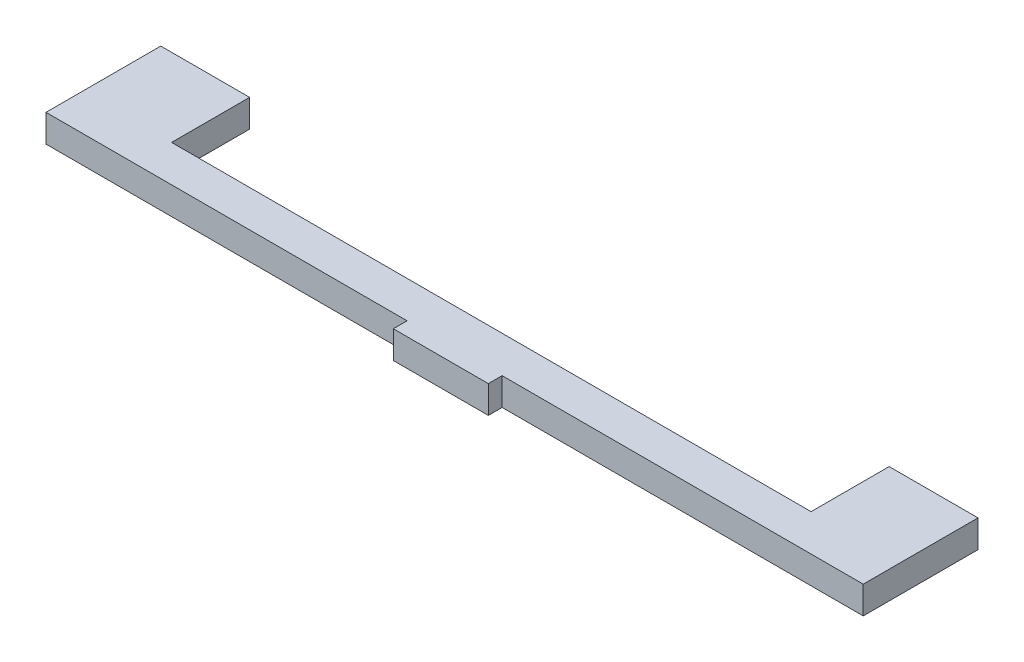
ISO-10303-21;
HEADER;
FILE_DESCRIPTION(('STEP AP214'),'2;1');
FILE_NAME('part.step','',(''),(''),'','','');
FILE_SCHEMA(('AUTOMOTIVE_DESIGN { 1 0 10303 214 1 1 1 1 }'));
ENDSEC;
DATA;
#1=APPLICATION_CONTEXT('core data for automotive mechanical design processes');
#2=APPLICATION_PROTOCOL_DEFINITION('international standard','automotive_design',2000,#1);
#3=PRODUCT_CONTEXT('',#1,'mechanical');
#4=PRODUCT('Part','Part','',(#3));
#5=PRODUCT_RELATED_PRODUCT_CATEGORY('part','',(#4));
#6=PRODUCT_DEFINITION_FORMATION('','',#4);
#7=PRODUCT_DEFINITION_CONTEXT('part definition',#1,'design');
#8=PRODUCT_DEFINITION('design','',#6,#7);
#9=PRODUCT_DEFINITION_SHAPE('','',#8);
#10=(LENGTH_UNIT() NAMED_UNIT(*) SI_UNIT(.MILLI.,.METRE.));
#11=(NAMED_UNIT(*) PLANE_ANGLE_UNIT() SI_UNIT($,.RADIAN.));
#12=(NAMED_UNIT(*) SI_UNIT($,.STERADIAN.) SOLID_ANGLE_UNIT());
#13=UNCERTAINTY_MEASURE_WITH_UNIT(LENGTH_MEASURE(1.E-05),#10,'distance_accuracy_value','');
#14=(GEOMETRIC_REPRESENTATION_CONTEXT(3) GLOBAL_UNCERTAINTY_ASSIGNED_CONTEXT((#13)) GLOBAL_UNIT_ASSIGNED_CONTEXT((#10,
#11,#12)) REPRESENTATION_CONTEXT('',''));
#15=CARTESIAN_POINT('',(0.,0.,0.));
#16=DIRECTION('',(0.,0.,1.));
#17=DIRECTION('',(1.,0.,0.));
#18=AXIS2_PLACEMENT_3D('',#15,#16,#17);
#19=CARTESIAN_POINT('',(-9.91875000000004,6.,9.98515625000002));
#20=DIRECTION('',(1.,0.,0.));
#21=DIRECTION('',(0.,0.,-1.));
#22=AXIS2_PLACEMENT_3D('',#19,#20,#21);
#23=PLANE('',#22);
#24=DIRECTION('',(0.,0.,1.));
#25=VECTOR('',#24,1.);
#26=CARTESIAN_POINT('',(-9.91875000000004,0.,9.98515625000002));
#27=LINE('',#26,#25);
#28=CARTESIAN_POINT('',(-9.91875000000004,0.,9.98515625000002));
#29=VERTEX_POINT('',#28);
#30=CARTESIAN_POINT('',(-9.91875000000004,0.,12.98515625));
#31=VERTEX_POINT('',#30);
#32=EDGE_CURVE('E155',#29,#31,#27,.T.);
#33=ORIENTED_EDGE('',*,*,#32,.T.);
#34=DIRECTION('',(0.,-1.,0.));
#35=VECTOR('',#34,1.);
#36=CARTESIAN_POINT('',(-9.91875000000004,6.,12.98515625));
#37=LINE('',#36,#35);
#38=CARTESIAN_POINT('',(-9.91875000000004,6.,12.98515625));
#39=VERTEX_POINT('',#38);
#40=EDGE_CURVE('E11',#39,#31,#37,.T.);
#41=ORIENTED_EDGE('',*,*,#40,.F.);
#42=DIRECTION('',(0.,0.,1.));
#43=VECTOR('',#42,1.);
#44=CARTESIAN_POINT('',(-9.91875000000004,6.,9.98515625000002));
#45=LINE('',#44,#43);
#46=CARTESIAN_POINT('',(-9.91875000000004,6.,9.98515625000002));
#47=VERTEX_POINT('',#46);
#48=EDGE_CURVE('E177',#47,#39,#45,.T.);
#49=ORIENTED_EDGE('',*,*,#48,.F.);
#50=DIRECTION('',(0.,-1.,0.));
#51=VECTOR('',#50,1.);
#52=CARTESIAN_POINT('',(-9.91875000000004,6.,9.98515625000002));
#53=LINE('',#52,#51);
#54=EDGE_CURVE('E151',#47,#29,#53,.T.);
#55=ORIENTED_EDGE('',*,*,#54,.T.);
#56=EDGE_LOOP('',(#33,#41,#49,#55));
#57=FACE_BOUND('',#56,.T.);
#58=ADVANCED_FACE('F35',(#57),#23,.F.);
#59=CARTESIAN_POINT('',(-9.91875000000004,6.,12.98515625));
#60=DIRECTION('',(0.,0.,-1.));
#61=DIRECTION('',(-1.,0.,0.));
#62=AXIS2_PLACEMENT_3D('',#59,#60,#61);
#63=PLANE('',#62);
#64=DIRECTION('',(1.,0.,0.));
#65=VECTOR('',#64,1.);
#66=CARTESIAN_POINT('',(-9.91875000000004,0.,12.98515625));
#67=LINE('',#66,#65);
#68=CARTESIAN_POINT('',(10.78125,0.,12.98515625));
#69=VERTEX_POINT('',#68);
#70=EDGE_CURVE('E158',#31,#69,#67,.T.);
#71=ORIENTED_EDGE('',*,*,#70,.T.);
#72=DIRECTION('',(0.,-1.,0.));
#73=VECTOR('',#72,1.);
#74=CARTESIAN_POINT('',(10.78125,6.,12.98515625));
#75=LINE('',#74,#73);
#76=CARTESIAN_POINT('',(10.78125,6.,12.98515625));
#77=VERTEX_POINT('',#76);
#78=EDGE_CURVE('E43',#77,#69,#75,.T.);
#79=ORIENTED_EDGE('',*,*,#78,.F.);
#80=DIRECTION('',(1.,0.,0.));
#81=VECTOR('',#80,1.);
#82=CARTESIAN_POINT('',(-9.91875000000004,6.,12.98515625));
#83=LINE('',#82,#81);
#84=EDGE_CURVE('E106',#39,#77,#83,.T.);
#85=ORIENTED_EDGE('',*,*,#84,.F.);
#86=ORIENTED_EDGE('',*,*,#40,.T.);
#87=EDGE_LOOP('',(#71,#79,#85,#86));
#88=FACE_BOUND('',#87,.T.);
#89=ADVANCED_FACE('F255',(#88),#63,.F.);
#90=CARTESIAN_POINT('',(10.78125,6.,12.98515625));
#91=DIRECTION('',(-1.,0.,0.));
#92=DIRECTION('',(0.,0.,1.));
#93=AXIS2_PLACEMENT_3D('',#90,#91,#92);
#94=PLANE('',#93);
#95=DIRECTION('',(0.,0.,-1.));
#96=VECTOR('',#95,1.);
#97=CARTESIAN_POINT('',(10.78125,0.,12.98515625));
#98=LINE('',#97,#96);
#99=CARTESIAN_POINT('',(10.78125,0.,9.98515625000002));
#100=VERTEX_POINT('',#99);
#101=EDGE_CURVE('E160',#69,#100,#98,.T.);
#102=ORIENTED_EDGE('',*,*,#101,.T.);
#103=DIRECTION('',(0.,-1.,0.));
#104=VECTOR('',#103,1.);
#105=CARTESIAN_POINT('',(10.78125,6.,9.98515625000002));
#106=LINE('',#105,#104);
#107=CARTESIAN_POINT('',(10.78125,6.,9.98515625000002));
#108=VERTEX_POINT('',#107);
#109=EDGE_CURVE('E196',#108,#100,#106,.T.);
#110=ORIENTED_EDGE('',*,*,#109,.F.);
#111=DIRECTION('',(0.,0.,-1.));
#112=VECTOR('',#111,1.);
#113=CARTESIAN_POINT('',(10.78125,6.,12.98515625));
#114=LINE('',#113,#112);
#115=EDGE_CURVE('E204',#77,#108,#114,.T.);
#116=ORIENTED_EDGE('',*,*,#115,.F.);
#117=ORIENTED_EDGE('',*,*,#78,.T.);
#118=EDGE_LOOP('',(#102,#110,#116,#117));
#119=FACE_BOUND('',#118,.T.);
#120=ADVANCED_FACE('F202',(#119),#94,.F.);
#121=CARTESIAN_POINT('',(10.78125,6.,9.98515625000002));
#122=DIRECTION('',(0.,0.,-1.));
#123=DIRECTION('',(-1.,0.,0.));
#124=AXIS2_PLACEMENT_3D('',#121,#122,#123);
#125=PLANE('',#124);
#126=DIRECTION('',(1.,0.,0.));
#127=VECTOR('',#126,1.);
#128=CARTESIAN_POINT('',(10.78125,0.,9.98515625000002));
#129=LINE('',#128,#127);
#130=CARTESIAN_POINT('',(89.4312499999999,0.,9.98515625000002));
#131=VERTEX_POINT('',#130);
#132=EDGE_CURVE('E162',#100,#131,#129,.T.);
#133=ORIENTED_EDGE('',*,*,#132,.T.);
#134=DIRECTION('',(0.,-1.,0.));
#135=VECTOR('',#134,1.);
#136=CARTESIAN_POINT('',(89.4312499999999,6.,9.98515625000002));
#137=LINE('',#136,#135);
#138=CARTESIAN_POINT('',(89.4312499999999,6.,9.98515625000002));
#139=VERTEX_POINT('',#138);
#140=EDGE_CURVE('E193',#139,#131,#137,.T.);
#141=ORIENTED_EDGE('',*,*,#140,.F.);
#142=DIRECTION('',(1.,0.,0.));
#143=VECTOR('',#142,1.);
#144=CARTESIAN_POINT('',(10.78125,6.,9.98515625000002));
#145=LINE('',#144,#143);
#146=EDGE_CURVE('E222',#108,#139,#145,.T.);
#147=ORIENTED_EDGE('',*,*,#146,.F.);
#148=ORIENTED_EDGE('',*,*,#109,.T.);
#149=EDGE_LOOP('',(#133,#141,#147,#148));
#150=FACE_BOUND('',#149,.T.);
#151=ADVANCED_FACE('F213',(#150),#125,.F.);
#152=CARTESIAN_POINT('',(89.4312499999999,6.,9.98515625000002));
#153=DIRECTION('',(-1.,0.,0.));
#154=DIRECTION('',(0.,0.,1.));
#155=AXIS2_PLACEMENT_3D('',#152,#153,#154);
#156=PLANE('',#155);
#157=DIRECTION('',(0.,0.,-1.));
#158=VECTOR('',#157,1.);
#159=CARTESIAN_POINT('',(89.4312499999999,0.,9.98515625000002));
#160=LINE('',#159,#158);
#161=CARTESIAN_POINT('',(89.4312499999999,0.,-15.01484375));
#162=VERTEX_POINT('',#161);
#163=EDGE_CURVE('E164',#131,#162,#160,.T.);
#164=ORIENTED_EDGE('',*,*,#163,.T.);
#165=DIRECTION('',(0.,-1.,0.));
#166=VECTOR('',#165,1.);
#167=CARTESIAN_POINT('',(89.4312499999999,6.,-15.01484375));
#168=LINE('',#167,#166);
#169=CARTESIAN_POINT('',(89.4312499999999,6.,-15.01484375));
#170=VERTEX_POINT('',#169);
#171=EDGE_CURVE('E190',#170,#162,#168,.T.);
#172=ORIENTED_EDGE('',*,*,#171,.F.);
#173=DIRECTION('',(0.,0.,-1.));
#174=VECTOR('',#173,1.);
#175=CARTESIAN_POINT('',(89.4312499999999,6.,9.98515625000002));
#176=LINE('',#175,#174);
#177=EDGE_CURVE('E219',#139,#170,#176,.T.);
#178=ORIENTED_EDGE('',*,*,#177,.F.);
#179=ORIENTED_EDGE('',*,*,#140,.T.);
#180=EDGE_LOOP('',(#164,#172,#178,#179));
#181=FACE_BOUND('',#180,.T.);
#182=ADVANCED_FACE('F217',(#181),#156,.F.);
#183=CARTESIAN_POINT('',(89.4312499999999,6.,-15.01484375));
#184=DIRECTION('',(0.,0.,1.));
#185=DIRECTION('',(1.,0.,0.));
#186=AXIS2_PLACEMENT_3D('',#183,#184,#185);
#187=PLANE('',#186);
#188=DIRECTION('',(-1.,0.,0.));
#189=VECTOR('',#188,1.);
#190=CARTESIAN_POINT('',(89.4312499999999,0.,-15.01484375));
#191=LINE('',#190,#189);
#192=CARTESIAN_POINT('',(70.078125,0.,-15.01484375));
#193=VERTEX_POINT('',#192);
#194=EDGE_CURVE('E166',#162,#193,#191,.T.);
#195=ORIENTED_EDGE('',*,*,#194,.T.);
#196=DIRECTION('',(0.,-1.,0.));
#197=VECTOR('',#196,1.);
#198=CARTESIAN_POINT('',(70.078125,6.,-15.01484375));
#199=LINE('',#198,#197);
#200=CARTESIAN_POINT('',(70.078125,6.,-15.01484375));
#201=VERTEX_POINT('',#200);
#202=EDGE_CURVE('E187',#201,#193,#199,.T.);
#203=ORIENTED_EDGE('',*,*,#202,.F.);
#204=DIRECTION('',(-1.,0.,0.));
#205=VECTOR('',#204,1.);
#206=CARTESIAN_POINT('',(89.4312499999999,6.,-15.01484375));
#207=LINE('',#206,#205);
#208=EDGE_CURVE('E221',#170,#201,#207,.T.);
#209=ORIENTED_EDGE('',*,*,#208,.F.);
#210=ORIENTED_EDGE('',*,*,#171,.T.);
#211=EDGE_LOOP('',(#195,#203,#209,#210));
#212=FACE_BOUND('',#211,.T.);
#213=ADVANCED_FACE('F268',(#212),#187,.F.);
#214=CARTESIAN_POINT('',(70.078125,6.,-15.01484375));
#215=DIRECTION('',(1.,0.,0.));
#216=DIRECTION('',(0.,0.,-1.));
#217=AXIS2_PLACEMENT_3D('',#214,#215,#216);
#218=PLANE('',#217);
#219=DIRECTION('',(0.,0.,1.));
#220=VECTOR('',#219,1.);
#221=CARTESIAN_POINT('',(70.078125,0.,-15.01484375));
#222=LINE('',#221,#220);
#223=CARTESIAN_POINT('',(70.078125,0.,1.98515625000002));
#224=VERTEX_POINT('',#223);
#225=EDGE_CURVE('E168',#193,#224,#222,.T.);
#226=ORIENTED_EDGE('',*,*,#225,.T.);
#227=DIRECTION('',(0.,-1.,0.));
#228=VECTOR('',#227,1.);
#229=CARTESIAN_POINT('',(70.078125,6.,1.98515625000002));
#230=LINE('',#229,#228);
#231=CARTESIAN_POINT('',(70.078125,6.,1.98515625000002));
#232=VERTEX_POINT('',#231);
#233=EDGE_CURVE('E184',#232,#224,#230,.T.);
#234=ORIENTED_EDGE('',*,*,#233,.F.);
#235=DIRECTION('',(0.,0.,1.));
#236=VECTOR('',#235,1.);
#237=CARTESIAN_POINT('',(70.078125,6.,-15.01484375));
#238=LINE('',#237,#236);
#239=EDGE_CURVE('E224',#201,#232,#238,.T.);
#240=ORIENTED_EDGE('',*,*,#239,.F.);
#241=ORIENTED_EDGE('',*,*,#202,.T.);
#242=EDGE_LOOP('',(#226,#234,#240,#241));
#243=FACE_BOUND('',#242,.T.);
#244=ADVANCED_FACE('F271',(#243),#218,.F.);
#245=CARTESIAN_POINT('',(70.078125,6.,1.98515625000002));
#246=DIRECTION('',(0.,0.,1.));
#247=DIRECTION('',(1.,0.,0.));
#248=AXIS2_PLACEMENT_3D('',#245,#246,#247);
#249=PLANE('',#248);
#250=DIRECTION('',(-1.,0.,0.));
#251=VECTOR('',#250,1.);
#252=CARTESIAN_POINT('',(70.078125,0.,1.98515625000002));
#253=LINE('',#252,#251);
#254=CARTESIAN_POINT('',(-69.2156250000001,0.,1.98515625000004));
#255=VERTEX_POINT('',#254);
#256=EDGE_CURVE('E170',#224,#255,#253,.T.);
#257=ORIENTED_EDGE('',*,*,#256,.T.);
#258=DIRECTION('',(0.,-1.,0.));
#259=VECTOR('',#258,1.);
#260=CARTESIAN_POINT('',(-69.2156250000001,6.,1.98515625000004));
#261=LINE('',#260,#259);
#262=CARTESIAN_POINT('',(-69.2156250000001,6.,1.98515625000004));
#263=VERTEX_POINT('',#262);
#264=EDGE_CURVE('E181',#263,#255,#261,.T.);
#265=ORIENTED_EDGE('',*,*,#264,.F.);
#266=DIRECTION('',(-1.,0.,0.));
#267=VECTOR('',#266,1.);
#268=CARTESIAN_POINT('',(70.078125,6.,1.98515625000002));
#269=LINE('',#268,#267);
#270=EDGE_CURVE('E230',#232,#263,#269,.T.);
#271=ORIENTED_EDGE('',*,*,#270,.F.);
#272=ORIENTED_EDGE('',*,*,#233,.T.);
#273=EDGE_LOOP('',(#257,#265,#271,#272));
#274=FACE_BOUND('',#273,.T.);
#275=ADVANCED_FACE('F236',(#274),#249,.F.);
#276=CARTESIAN_POINT('',(-69.2156250000001,6.,1.98515625000004));
#277=DIRECTION('',(-1.,0.,0.));
#278=DIRECTION('',(0.,0.,1.));
#279=AXIS2_PLACEMENT_3D('',#276,#277,#278);
#280=PLANE('',#279);
#281=DIRECTION('',(0.,0.,-1.));
#282=VECTOR('',#281,1.);
#283=CARTESIAN_POINT('',(-69.2156250000001,0.,1.98515625000004));
#284=LINE('',#283,#282);
#285=CARTESIAN_POINT('',(-69.2156250000001,0.,-15.01484375));
#286=VERTEX_POINT('',#285);
#287=EDGE_CURVE('E172',#255,#286,#284,.T.);
#288=ORIENTED_EDGE('',*,*,#287,.T.);
#289=DIRECTION('',(0.,-1.,0.));
#290=VECTOR('',#289,1.);
#291=CARTESIAN_POINT('',(-69.2156250000001,6.,-15.01484375));
#292=LINE('',#291,#290);
#293=CARTESIAN_POINT('',(-69.2156250000001,6.,-15.01484375));
#294=VERTEX_POINT('',#293);
#295=EDGE_CURVE('E146',#294,#286,#292,.T.);
#296=ORIENTED_EDGE('',*,*,#295,.F.);
#297=DIRECTION('',(0.,0.,-1.));
#298=VECTOR('',#297,1.);
#299=CARTESIAN_POINT('',(-69.2156250000001,6.,1.98515625000004));
#300=LINE('',#299,#298);
#301=EDGE_CURVE('E137',#263,#294,#300,.T.);
#302=ORIENTED_EDGE('',*,*,#301,.F.);
#303=ORIENTED_EDGE('',*,*,#264,.T.);
#304=EDGE_LOOP('',(#288,#296,#302,#303));
#305=FACE_BOUND('',#304,.T.);
#306=ADVANCED_FACE('F240',(#305),#280,.F.);
#307=CARTESIAN_POINT('',(-69.2156250000001,6.,-15.01484375));
#308=DIRECTION('',(0.,0.,1.));
#309=DIRECTION('',(1.,0.,0.));
#310=AXIS2_PLACEMENT_3D('',#307,#308,#309);
#311=PLANE('',#310);
#312=DIRECTION('',(-1.,0.,0.));
#313=VECTOR('',#312,1.);
#314=CARTESIAN_POINT('',(-69.2156250000001,0.,-15.01484375));
#315=LINE('',#314,#313);
#316=CARTESIAN_POINT('',(-88.56875,0.,-15.0148437499999));
#317=VERTEX_POINT('',#316);
#318=EDGE_CURVE('E145',#286,#317,#315,.T.);
#319=ORIENTED_EDGE('',*,*,#318,.T.);
#320=DIRECTION('',(0.,-1.,0.));
#321=VECTOR('',#320,1.);
#322=CARTESIAN_POINT('',(-88.56875,6.,-15.0148437499999));
#323=LINE('',#322,#321);
#324=CARTESIAN_POINT('',(-88.56875,6.,-15.0148437499999));
#325=VERTEX_POINT('',#324);
#326=EDGE_CURVE('E142',#325,#317,#323,.T.);
#327=ORIENTED_EDGE('',*,*,#326,.F.);
#328=DIRECTION('',(-1.,0.,0.));
#329=VECTOR('',#328,1.);
#330=CARTESIAN_POINT('',(-69.2156250000001,6.,-15.01484375));
#331=LINE('',#330,#329);
#332=EDGE_CURVE('E131',#294,#325,#331,.T.);
#333=ORIENTED_EDGE('',*,*,#332,.F.);
#334=ORIENTED_EDGE('',*,*,#295,.T.);
#335=EDGE_LOOP('',(#319,#327,#333,#334));
#336=FACE_BOUND('',#335,.T.);
#337=ADVANCED_FACE('F143',(#336),#311,.F.);
#338=CARTESIAN_POINT('',(-88.56875,6.,-15.0148437499999));
#339=DIRECTION('',(1.,0.,0.));
#340=DIRECTION('',(0.,0.,-1.));
#341=AXIS2_PLACEMENT_3D('',#338,#339,#340);
#342=PLANE('',#341);
#343=DIRECTION('',(0.,0.,1.));
#344=VECTOR('',#343,1.);
#345=CARTESIAN_POINT('',(-88.56875,0.,-15.0148437499999));
#346=LINE('',#345,#344);
#347=CARTESIAN_POINT('',(-88.56875,0.,9.98515625000002));
#348=VERTEX_POINT('',#347);
#349=EDGE_CURVE('E92',#317,#348,#346,.T.);
#350=ORIENTED_EDGE('',*,*,#349,.T.);
#351=DIRECTION('',(0.,-1.,0.));
#352=VECTOR('',#351,1.);
#353=CARTESIAN_POINT('',(-88.56875,6.,9.98515625000002));
#354=LINE('',#353,#352);
#355=CARTESIAN_POINT('',(-88.56875,6.,9.98515625000002));
#356=VERTEX_POINT('',#355);
#357=EDGE_CURVE('E147',#356,#348,#354,.T.);
#358=ORIENTED_EDGE('',*,*,#357,.F.);
#359=DIRECTION('',(0.,0.,1.));
#360=VECTOR('',#359,1.);
#361=CARTESIAN_POINT('',(-88.56875,6.,-15.0148437499999));
#362=LINE('',#361,#360);
#363=EDGE_CURVE('E135',#325,#356,#362,.T.);
#364=ORIENTED_EDGE('',*,*,#363,.F.);
#365=ORIENTED_EDGE('',*,*,#326,.T.);
#366=EDGE_LOOP('',(#350,#358,#364,#365));
#367=FACE_BOUND('',#366,.T.);
#368=ADVANCED_FACE('F149',(#367),#342,.F.);
#369=CARTESIAN_POINT('',(-88.56875,6.,9.98515625000002));
#370=DIRECTION('',(0.,0.,-1.));
#371=DIRECTION('',(-1.,0.,0.));
#372=AXIS2_PLACEMENT_3D('',#369,#370,#371);
#373=PLANE('',#372);
#374=DIRECTION('',(1.,0.,0.));
#375=VECTOR('',#374,1.);
#376=CARTESIAN_POINT('',(-88.56875,0.,9.98515625000002));
#377=LINE('',#376,#375);
#378=EDGE_CURVE('E98',#348,#29,#377,.T.);
#379=ORIENTED_EDGE('',*,*,#378,.T.);
#380=ORIENTED_EDGE('',*,*,#54,.F.);
#381=DIRECTION('',(1.,0.,0.));
#382=VECTOR('',#381,1.);
#383=CARTESIAN_POINT('',(-88.56875,6.,9.98515625000002));
#384=LINE('',#383,#382);
#385=EDGE_CURVE('E51',#356,#47,#384,.T.);
#386=ORIENTED_EDGE('',*,*,#385,.F.);
#387=ORIENTED_EDGE('',*,*,#357,.T.);
#388=EDGE_LOOP('',(#379,#380,#386,#387));
#389=FACE_BOUND('',#388,.T.);
#390=ADVANCED_FACE('F244',(#389),#373,.F.);
#391=CARTESIAN_POINT('',(0.,6.,0.));
#392=DIRECTION('',(0.,1.,0.));
#393=DIRECTION('',(0.,0.,1.));
#394=AXIS2_PLACEMENT_3D('',#391,#392,#393);
#395=PLANE('',#394);
#396=ORIENTED_EDGE('',*,*,#48,.T.);
#397=ORIENTED_EDGE('',*,*,#84,.T.);
#398=ORIENTED_EDGE('',*,*,#115,.T.);
#399=ORIENTED_EDGE('',*,*,#146,.T.);
#400=ORIENTED_EDGE('',*,*,#177,.T.);
#401=ORIENTED_EDGE('',*,*,#208,.T.);
#402=ORIENTED_EDGE('',*,*,#239,.T.);
#403=ORIENTED_EDGE('',*,*,#270,.T.);
#404=ORIENTED_EDGE('',*,*,#301,.T.);
#405=ORIENTED_EDGE('',*,*,#332,.T.);
#406=ORIENTED_EDGE('',*,*,#363,.T.);
#407=ORIENTED_EDGE('',*,*,#385,.T.);
#408=EDGE_LOOP('',(#396,#397,#398,#399,#400,#401,#402,#403,#404,#405,#406,#407));
#409=FACE_BOUND('',#408,.T.);
#410=ADVANCED_FACE('F133',(#409),#395,.T.);
#411=CARTESIAN_POINT('',(0.,0.,0.));
#412=DIRECTION('',(0.,1.,0.));
#413=DIRECTION('',(0.,0.,1.));
#414=AXIS2_PLACEMENT_3D('',#411,#412,#413);
#415=PLANE('',#414);
#416=ORIENTED_EDGE('',*,*,#32,.F.);
#417=ORIENTED_EDGE('',*,*,#378,.F.);
#418=ORIENTED_EDGE('',*,*,#349,.F.);
#419=ORIENTED_EDGE('',*,*,#318,.F.);
#420=ORIENTED_EDGE('',*,*,#287,.F.);
#421=ORIENTED_EDGE('',*,*,#256,.F.);
#422=ORIENTED_EDGE('',*,*,#225,.F.);
#423=ORIENTED_EDGE('',*,*,#194,.F.);
#424=ORIENTED_EDGE('',*,*,#163,.F.);
#425=ORIENTED_EDGE('',*,*,#132,.F.);
#426=ORIENTED_EDGE('',*,*,#101,.F.);
#427=ORIENTED_EDGE('',*,*,#70,.F.);
#428=EDGE_LOOP('',(#416,#417,#418,#419,#420,#421,#422,#423,#424,#425,#426,#427));
#429=FACE_BOUND('',#428,.T.);
#430=ADVANCED_FACE('F208',(#429),#415,.F.);
#431=CLOSED_SHELL('',(#58,#89,#120,#151,#182,#213,#244,#275,#306,#337,#368,#390,#410,#430));
#432=MANIFOLD_SOLID_BREP('B2',#431);
#433=ADVANCED_BREP_SHAPE_REPRESENTATION('',(#18,#432),#14);
#434=SHAPE_DEFINITION_REPRESENTATION(#9,#433);
ENDSEC;
END-ISO-10303-21;
